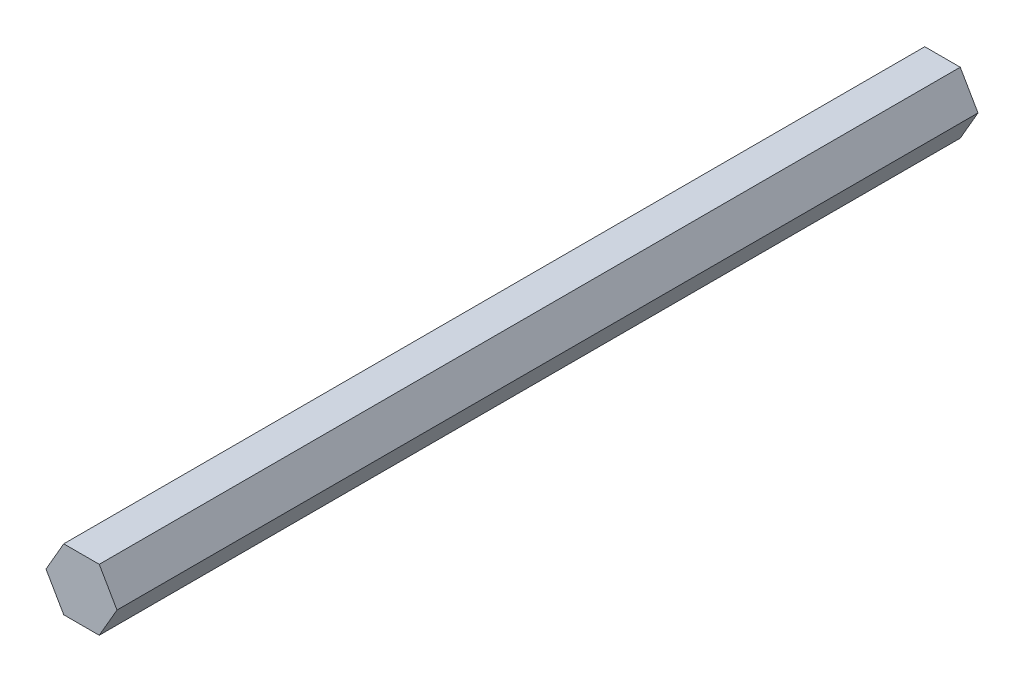
ISO-10303-21;
HEADER;
FILE_DESCRIPTION(('STEP AP214'),'2;1');
FILE_NAME('part.step','',(''),(''),'','','');
FILE_SCHEMA(('AUTOMOTIVE_DESIGN { 1 0 10303 214 1 1 1 1 }'));
ENDSEC;
DATA;
#1=APPLICATION_CONTEXT('core data for automotive mechanical design processes');
#2=APPLICATION_PROTOCOL_DEFINITION('international standard','automotive_design',2000,#1);
#3=PRODUCT_CONTEXT('',#1,'mechanical');
#4=PRODUCT('Part','Part','',(#3));
#5=PRODUCT_RELATED_PRODUCT_CATEGORY('part','',(#4));
#6=PRODUCT_DEFINITION_FORMATION('','',#4);
#7=PRODUCT_DEFINITION_CONTEXT('part definition',#1,'design');
#8=PRODUCT_DEFINITION('design','',#6,#7);
#9=PRODUCT_DEFINITION_SHAPE('','',#8);
#10=(LENGTH_UNIT() NAMED_UNIT(*) SI_UNIT(.MILLI.,.METRE.));
#11=(NAMED_UNIT(*) PLANE_ANGLE_UNIT() SI_UNIT($,.RADIAN.));
#12=(NAMED_UNIT(*) SI_UNIT($,.STERADIAN.) SOLID_ANGLE_UNIT());
#13=UNCERTAINTY_MEASURE_WITH_UNIT(LENGTH_MEASURE(1.E-05),#10,'distance_accuracy_value','');
#14=(GEOMETRIC_REPRESENTATION_CONTEXT(3) GLOBAL_UNCERTAINTY_ASSIGNED_CONTEXT((#13)) GLOBAL_UNIT_ASSIGNED_CONTEXT((#10,
#11,#12)) REPRESENTATION_CONTEXT('',''));
#15=CARTESIAN_POINT('',(0.,0.,0.));
#16=DIRECTION('',(0.,0.,1.));
#17=DIRECTION('',(1.,0.,0.));
#18=AXIS2_PLACEMENT_3D('',#15,#16,#17);
#19=CARTESIAN_POINT('',(7.33234841870825,0.,88.93175));
#20=DIRECTION('',(-0.866025403784439,-0.5,0.));
#21=DIRECTION('',(0.5,-0.866025403784439,0.));
#22=AXIS2_PLACEMENT_3D('',#19,#20,#21);
#23=PLANE('',#22);
#24=DIRECTION('',(-0.5,0.866025403784439,0.));
#25=VECTOR('',#24,1.);
#26=CARTESIAN_POINT('',(7.33234841870825,0.,-88.93175));
#27=LINE('',#26,#25);
#28=CARTESIAN_POINT('',(7.33234841870825,0.,-88.93175));
#29=VERTEX_POINT('',#28);
#30=CARTESIAN_POINT('',(3.66617420935413,6.35,-88.93175));
#31=VERTEX_POINT('',#30);
#32=EDGE_CURVE('E116',#29,#31,#27,.T.);
#33=ORIENTED_EDGE('',*,*,#32,.T.);
#34=DIRECTION('',(0.,0.,-1.));
#35=VECTOR('',#34,1.);
#36=CARTESIAN_POINT('',(3.66617420935413,6.35,88.93175));
#37=LINE('',#36,#35);
#38=CARTESIAN_POINT('',(3.66617420935413,6.35,88.93175));
#39=VERTEX_POINT('',#38);
#40=EDGE_CURVE('E11',#39,#31,#37,.T.);
#41=ORIENTED_EDGE('',*,*,#40,.F.);
#42=DIRECTION('',(-0.5,0.866025403784439,0.));
#43=VECTOR('',#42,1.);
#44=CARTESIAN_POINT('',(7.33234841870825,0.,88.93175));
#45=LINE('',#44,#43);
#46=CARTESIAN_POINT('',(7.33234841870825,0.,88.93175));
#47=VERTEX_POINT('',#46);
#48=EDGE_CURVE('E126',#47,#39,#45,.T.);
#49=ORIENTED_EDGE('',*,*,#48,.F.);
#50=DIRECTION('',(0.,0.,-1.));
#51=VECTOR('',#50,1.);
#52=CARTESIAN_POINT('',(7.33234841870825,0.,88.93175));
#53=LINE('',#52,#51);
#54=EDGE_CURVE('E112',#47,#29,#53,.T.);
#55=ORIENTED_EDGE('',*,*,#54,.T.);
#56=EDGE_LOOP('',(#33,#41,#49,#55));
#57=FACE_BOUND('',#56,.T.);
#58=ADVANCED_FACE('F32',(#57),#23,.F.);
#59=CARTESIAN_POINT('',(3.66617420935413,6.35,88.93175));
#60=DIRECTION('',(0.,-1.,0.));
#61=DIRECTION('',(1.,0.,0.));
#62=AXIS2_PLACEMENT_3D('',#59,#60,#61);
#63=PLANE('',#62);
#64=DIRECTION('',(-1.,0.,0.));
#65=VECTOR('',#64,1.);
#66=CARTESIAN_POINT('',(3.66617420935413,6.35,-88.93175));
#67=LINE('',#66,#65);
#68=CARTESIAN_POINT('',(-3.66617420935412,6.35,-88.93175));
#69=VERTEX_POINT('',#68);
#70=EDGE_CURVE('E119',#31,#69,#67,.T.);
#71=ORIENTED_EDGE('',*,*,#70,.T.);
#72=DIRECTION('',(0.,0.,-1.));
#73=VECTOR('',#72,1.);
#74=CARTESIAN_POINT('',(-3.66617420935412,6.35,88.93175));
#75=LINE('',#74,#73);
#76=CARTESIAN_POINT('',(-3.66617420935412,6.35,88.93175));
#77=VERTEX_POINT('',#76);
#78=EDGE_CURVE('E40',#77,#69,#75,.T.);
#79=ORIENTED_EDGE('',*,*,#78,.F.);
#80=DIRECTION('',(-1.,0.,0.));
#81=VECTOR('',#80,1.);
#82=CARTESIAN_POINT('',(3.66617420935413,6.35,88.93175));
#83=LINE('',#82,#81);
#84=EDGE_CURVE('E85',#39,#77,#83,.T.);
#85=ORIENTED_EDGE('',*,*,#84,.F.);
#86=ORIENTED_EDGE('',*,*,#40,.T.);
#87=EDGE_LOOP('',(#71,#79,#85,#86));
#88=FACE_BOUND('',#87,.T.);
#89=ADVANCED_FACE('F150',(#88),#63,.F.);
#90=CARTESIAN_POINT('',(-3.66617420935412,6.35,88.93175));
#91=DIRECTION('',(0.866025403784439,-0.5,0.));
#92=DIRECTION('',(0.5,0.866025403784439,0.));
#93=AXIS2_PLACEMENT_3D('',#90,#91,#92);
#94=PLANE('',#93);
#95=DIRECTION('',(-0.5,-0.866025403784439,0.));
#96=VECTOR('',#95,1.);
#97=CARTESIAN_POINT('',(-3.66617420935412,6.35,-88.93175));
#98=LINE('',#97,#96);
#99=CARTESIAN_POINT('',(-7.33234841870824,0.,-88.93175));
#100=VERTEX_POINT('',#99);
#101=EDGE_CURVE('E121',#69,#100,#98,.T.);
#102=ORIENTED_EDGE('',*,*,#101,.T.);
#103=DIRECTION('',(0.,0.,-1.));
#104=VECTOR('',#103,1.);
#105=CARTESIAN_POINT('',(-7.33234841870824,0.,88.93175));
#106=LINE('',#105,#104);
#107=CARTESIAN_POINT('',(-7.33234841870824,0.,88.93175));
#108=VERTEX_POINT('',#107);
#109=EDGE_CURVE('E107',#108,#100,#106,.T.);
#110=ORIENTED_EDGE('',*,*,#109,.F.);
#111=DIRECTION('',(-0.5,-0.866025403784439,0.));
#112=VECTOR('',#111,1.);
#113=CARTESIAN_POINT('',(-3.66617420935412,6.35,88.93175));
#114=LINE('',#113,#112);
#115=EDGE_CURVE('E98',#77,#108,#114,.T.);
#116=ORIENTED_EDGE('',*,*,#115,.F.);
#117=ORIENTED_EDGE('',*,*,#78,.T.);
#118=EDGE_LOOP('',(#102,#110,#116,#117));
#119=FACE_BOUND('',#118,.T.);
#120=ADVANCED_FACE('F132',(#119),#94,.F.);
#121=CARTESIAN_POINT('',(-7.33234841870824,0.,88.93175));
#122=DIRECTION('',(0.866025403784439,0.5,0.));
#123=DIRECTION('',(-0.5,0.866025403784439,0.));
#124=AXIS2_PLACEMENT_3D('',#121,#122,#123);
#125=PLANE('',#124);
#126=DIRECTION('',(0.5,-0.866025403784439,0.));
#127=VECTOR('',#126,1.);
#128=CARTESIAN_POINT('',(-7.33234841870824,0.,-88.93175));
#129=LINE('',#128,#127);
#130=CARTESIAN_POINT('',(-3.66617420935412,-6.35,-88.93175));
#131=VERTEX_POINT('',#130);
#132=EDGE_CURVE('E106',#100,#131,#129,.T.);
#133=ORIENTED_EDGE('',*,*,#132,.T.);
#134=DIRECTION('',(0.,0.,-1.));
#135=VECTOR('',#134,1.);
#136=CARTESIAN_POINT('',(-3.66617420935412,-6.35,88.93175));
#137=LINE('',#136,#135);
#138=CARTESIAN_POINT('',(-3.66617420935412,-6.35,88.93175));
#139=VERTEX_POINT('',#138);
#140=EDGE_CURVE('E103',#139,#131,#137,.T.);
#141=ORIENTED_EDGE('',*,*,#140,.F.);
#142=DIRECTION('',(0.5,-0.866025403784439,0.));
#143=VECTOR('',#142,1.);
#144=CARTESIAN_POINT('',(-7.33234841870824,0.,88.93175));
#145=LINE('',#144,#143);
#146=EDGE_CURVE('E92',#108,#139,#145,.T.);
#147=ORIENTED_EDGE('',*,*,#146,.F.);
#148=ORIENTED_EDGE('',*,*,#109,.T.);
#149=EDGE_LOOP('',(#133,#141,#147,#148));
#150=FACE_BOUND('',#149,.T.);
#151=ADVANCED_FACE('F104',(#150),#125,.F.);
#152=CARTESIAN_POINT('',(-3.66617420935412,-6.35,88.93175));
#153=DIRECTION('',(0.,1.,0.));
#154=DIRECTION('',(-1.,0.,0.));
#155=AXIS2_PLACEMENT_3D('',#152,#153,#154);
#156=PLANE('',#155);
#157=DIRECTION('',(1.,0.,0.));
#158=VECTOR('',#157,1.);
#159=CARTESIAN_POINT('',(-3.66617420935412,-6.35,-88.93175));
#160=LINE('',#159,#158);
#161=CARTESIAN_POINT('',(3.66617420935412,-6.35,-88.93175));
#162=VERTEX_POINT('',#161);
#163=EDGE_CURVE('E71',#131,#162,#160,.T.);
#164=ORIENTED_EDGE('',*,*,#163,.T.);
#165=DIRECTION('',(0.,0.,-1.));
#166=VECTOR('',#165,1.);
#167=CARTESIAN_POINT('',(3.66617420935412,-6.35,88.93175));
#168=LINE('',#167,#166);
#169=CARTESIAN_POINT('',(3.66617420935412,-6.35,88.93175));
#170=VERTEX_POINT('',#169);
#171=EDGE_CURVE('E108',#170,#162,#168,.T.);
#172=ORIENTED_EDGE('',*,*,#171,.F.);
#173=DIRECTION('',(1.,0.,0.));
#174=VECTOR('',#173,1.);
#175=CARTESIAN_POINT('',(-3.66617420935412,-6.35,88.93175));
#176=LINE('',#175,#174);
#177=EDGE_CURVE('E96',#139,#170,#176,.T.);
#178=ORIENTED_EDGE('',*,*,#177,.F.);
#179=ORIENTED_EDGE('',*,*,#140,.T.);
#180=EDGE_LOOP('',(#164,#172,#178,#179));
#181=FACE_BOUND('',#180,.T.);
#182=ADVANCED_FACE('F110',(#181),#156,.F.);
#183=CARTESIAN_POINT('',(3.66617420935412,-6.35,88.93175));
#184=DIRECTION('',(-0.866025403784439,0.5,0.));
#185=DIRECTION('',(-0.5,-0.866025403784439,0.));
#186=AXIS2_PLACEMENT_3D('',#183,#184,#185);
#187=PLANE('',#186);
#188=DIRECTION('',(0.5,0.866025403784439,0.));
#189=VECTOR('',#188,1.);
#190=CARTESIAN_POINT('',(3.66617420935412,-6.35,-88.93175));
#191=LINE('',#190,#189);
#192=EDGE_CURVE('E77',#162,#29,#191,.T.);
#193=ORIENTED_EDGE('',*,*,#192,.T.);
#194=ORIENTED_EDGE('',*,*,#54,.F.);
#195=DIRECTION('',(0.5,0.866025403784439,0.));
#196=VECTOR('',#195,1.);
#197=CARTESIAN_POINT('',(3.66617420935412,-6.35,88.93175));
#198=LINE('',#197,#196);
#199=EDGE_CURVE('E48',#170,#47,#198,.T.);
#200=ORIENTED_EDGE('',*,*,#199,.F.);
#201=ORIENTED_EDGE('',*,*,#171,.T.);
#202=EDGE_LOOP('',(#193,#194,#200,#201));
#203=FACE_BOUND('',#202,.T.);
#204=ADVANCED_FACE('F139',(#203),#187,.F.);
#205=CARTESIAN_POINT('',(0.,0.,88.93175));
#206=DIRECTION('',(0.,0.,1.));
#207=DIRECTION('',(1.,0.,0.));
#208=AXIS2_PLACEMENT_3D('',#205,#206,#207);
#209=PLANE('',#208);
#210=ORIENTED_EDGE('',*,*,#48,.T.);
#211=ORIENTED_EDGE('',*,*,#84,.T.);
#212=ORIENTED_EDGE('',*,*,#115,.T.);
#213=ORIENTED_EDGE('',*,*,#146,.T.);
#214=ORIENTED_EDGE('',*,*,#177,.T.);
#215=ORIENTED_EDGE('',*,*,#199,.T.);
#216=EDGE_LOOP('',(#210,#211,#212,#213,#214,#215));
#217=FACE_BOUND('',#216,.T.);
#218=ADVANCED_FACE('F94',(#217),#209,.T.);
#219=CARTESIAN_POINT('',(0.,0.,-88.93175));
#220=DIRECTION('',(0.,0.,1.));
#221=DIRECTION('',(1.,0.,0.));
#222=AXIS2_PLACEMENT_3D('',#219,#220,#221);
#223=PLANE('',#222);
#224=ORIENTED_EDGE('',*,*,#32,.F.);
#225=ORIENTED_EDGE('',*,*,#192,.F.);
#226=ORIENTED_EDGE('',*,*,#163,.F.);
#227=ORIENTED_EDGE('',*,*,#132,.F.);
#228=ORIENTED_EDGE('',*,*,#101,.F.);
#229=ORIENTED_EDGE('',*,*,#70,.F.);
#230=EDGE_LOOP('',(#224,#225,#226,#227,#228,#229));
#231=FACE_BOUND('',#230,.T.);
#232=ADVANCED_FACE('F135',(#231),#223,.F.);
#233=CLOSED_SHELL('',(#58,#89,#120,#151,#182,#204,#218,#232));
#234=MANIFOLD_SOLID_BREP('B2',#233);
#235=ADVANCED_BREP_SHAPE_REPRESENTATION('',(#18,#234),#14);
#236=SHAPE_DEFINITION_REPRESENTATION(#9,#235);
ENDSEC;
END-ISO-10303-21;
